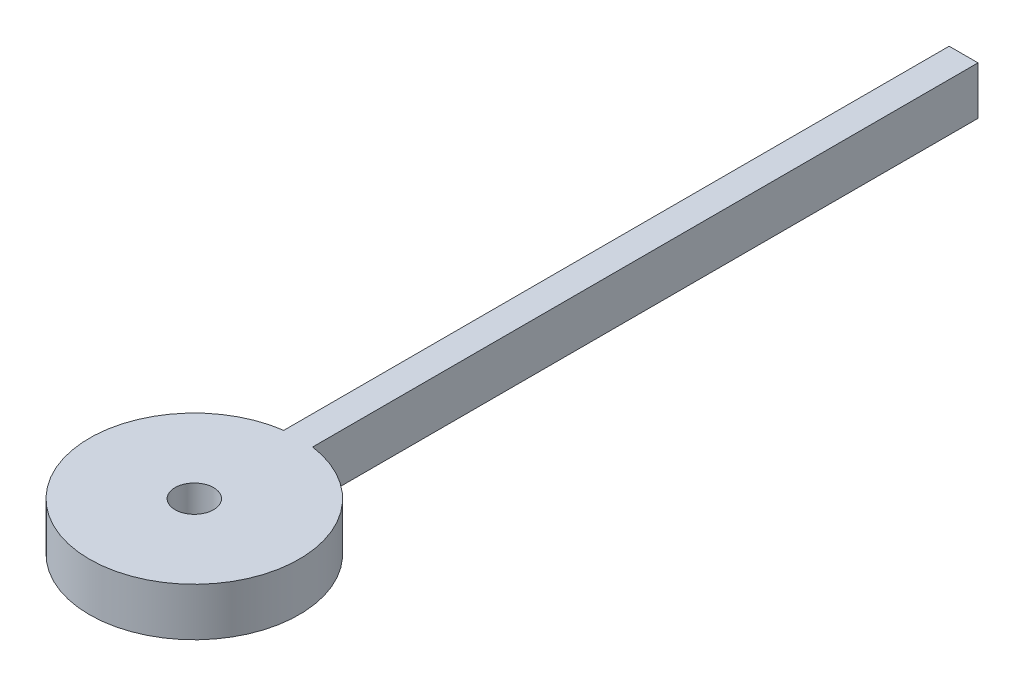
ISO-10303-21;
HEADER;
FILE_DESCRIPTION(('STEP AP214'),'2;1');
FILE_NAME('part.step','',(''),(''),'','','');
FILE_SCHEMA(('AUTOMOTIVE_DESIGN { 1 0 10303 214 1 1 1 1 }'));
ENDSEC;
DATA;
#1=APPLICATION_CONTEXT('core data for automotive mechanical design processes');
#2=APPLICATION_PROTOCOL_DEFINITION('international standard','automotive_design',2000,#1);
#3=PRODUCT_CONTEXT('',#1,'mechanical');
#4=PRODUCT('Part','Part','',(#3));
#5=PRODUCT_RELATED_PRODUCT_CATEGORY('part','',(#4));
#6=PRODUCT_DEFINITION_FORMATION('','',#4);
#7=PRODUCT_DEFINITION_CONTEXT('part definition',#1,'design');
#8=PRODUCT_DEFINITION('design','',#6,#7);
#9=PRODUCT_DEFINITION_SHAPE('','',#8);
#10=(LENGTH_UNIT() NAMED_UNIT(*) SI_UNIT(.MILLI.,.METRE.));
#11=(NAMED_UNIT(*) PLANE_ANGLE_UNIT() SI_UNIT($,.RADIAN.));
#12=(NAMED_UNIT(*) SI_UNIT($,.STERADIAN.) SOLID_ANGLE_UNIT());
#13=UNCERTAINTY_MEASURE_WITH_UNIT(LENGTH_MEASURE(1.E-05),#10,'distance_accuracy_value','');
#14=(GEOMETRIC_REPRESENTATION_CONTEXT(3) GLOBAL_UNCERTAINTY_ASSIGNED_CONTEXT((#13)) GLOBAL_UNIT_ASSIGNED_CONTEXT((#10,
#11,#12)) REPRESENTATION_CONTEXT('',''));
#15=CARTESIAN_POINT('',(0.,0.,0.));
#16=DIRECTION('',(0.,0.,1.));
#17=DIRECTION('',(1.,0.,0.));
#18=AXIS2_PLACEMENT_3D('',#15,#16,#17);
#19=CARTESIAN_POINT('',(-1.07430886798822E-13,10.,0.));
#20=DIRECTION('',(0.,1.,0.));
#21=DIRECTION('',(0.,0.,1.));
#22=AXIS2_PLACEMENT_3D('',#19,#20,#21);
#23=PLANE('',#22);
#24=DIRECTION('',(0.,0.,-1.));
#25=VECTOR('',#24,1.);
#26=CARTESIAN_POINT('',(2.99999999999989,10.,-21.6100690484735));
#27=LINE('',#26,#25);
#28=CARTESIAN_POINT('',(2.9999999999999,10.,-21.6100690484735));
#29=VERTEX_POINT('',#28);
#30=CARTESIAN_POINT('',(2.99999999999989,10.,-160.));
#31=VERTEX_POINT('',#30);
#32=EDGE_CURVE('E85',#29,#31,#27,.T.);
#33=ORIENTED_EDGE('',*,*,#32,.T.);
#34=DIRECTION('',(-1.,0.,0.));
#35=VECTOR('',#34,1.);
#36=CARTESIAN_POINT('',(-3.00000000000011,10.,-160.));
#37=LINE('',#36,#35);
#38=CARTESIAN_POINT('',(-3.00000000000011,10.,-160.));
#39=VERTEX_POINT('',#38);
#40=EDGE_CURVE('E80',#31,#39,#37,.T.);
#41=ORIENTED_EDGE('',*,*,#40,.T.);
#42=DIRECTION('',(0.,0.,1.));
#43=VECTOR('',#42,1.);
#44=CARTESIAN_POINT('',(-3.00000000000011,10.,-21.6100690484735));
#45=LINE('',#44,#43);
#46=CARTESIAN_POINT('',(-3.00000000000011,10.,-21.6100690484735));
#47=VERTEX_POINT('',#46);
#48=EDGE_CURVE('E83',#39,#47,#45,.T.);
#49=ORIENTED_EDGE('',*,*,#48,.T.);
#50=CARTESIAN_POINT('',(-1.07430886798822E-13,10.,0.));
#51=DIRECTION('',(0.,1.,0.));
#52=DIRECTION('',(0.,0.,1.));
#53=AXIS2_PLACEMENT_3D('',#50,#51,#52);
#54=CIRCLE('',#53,21.8173115731475);
#55=EDGE_CURVE('E50',#47,#29,#54,.T.);
#56=ORIENTED_EDGE('',*,*,#55,.T.);
#57=EDGE_LOOP('',(#33,#41,#49,#56));
#58=FACE_BOUND('',#57,.T.);
#59=CARTESIAN_POINT('',(-1.07430886798822E-13,10.,0.));
#60=DIRECTION('',(0.,1.,0.));
#61=DIRECTION('',(0.,0.,1.));
#62=AXIS2_PLACEMENT_3D('',#59,#60,#61);
#63=CIRCLE('',#62,4.);
#64=CARTESIAN_POINT('',(-1.07430886798822E-13,10.,4.0000000000001));
#65=VERTEX_POINT('',#64);
#66=EDGE_CURVE('E100',#65,#65,#63,.T.);
#67=ORIENTED_EDGE('',*,*,#66,.F.);
#68=EDGE_LOOP('',(#67));
#69=FACE_BOUND('',#68,.T.);
#70=ADVANCED_FACE('F33',(#58,#69),#23,.T.);
#71=CARTESIAN_POINT('',(-1.07430886798822E-13,0.,0.));
#72=DIRECTION('',(0.,1.,0.));
#73=DIRECTION('',(0.,0.,1.));
#74=AXIS2_PLACEMENT_3D('',#71,#72,#73);
#75=PLANE('',#74);
#76=DIRECTION('',(0.,0.,-1.));
#77=VECTOR('',#76,1.);
#78=CARTESIAN_POINT('',(2.99999999999989,0.,-21.6100690484735));
#79=LINE('',#78,#77);
#80=CARTESIAN_POINT('',(2.9999999999999,0.,-21.6100690484735));
#81=VERTEX_POINT('',#80);
#82=CARTESIAN_POINT('',(2.99999999999989,0.,-160.));
#83=VERTEX_POINT('',#82);
#84=EDGE_CURVE('E97',#81,#83,#79,.T.);
#85=ORIENTED_EDGE('',*,*,#84,.F.);
#86=CARTESIAN_POINT('',(-1.07430886798822E-13,0.,0.));
#87=DIRECTION('',(0.,1.,0.));
#88=DIRECTION('',(0.,0.,1.));
#89=AXIS2_PLACEMENT_3D('',#86,#87,#88);
#90=CIRCLE('',#89,21.8173115731475);
#91=CARTESIAN_POINT('',(-3.00000000000011,0.,-21.6100690484735));
#92=VERTEX_POINT('',#91);
#93=EDGE_CURVE('E73',#92,#81,#90,.T.);
#94=ORIENTED_EDGE('',*,*,#93,.F.);
#95=DIRECTION('',(0.,0.,1.));
#96=VECTOR('',#95,1.);
#97=CARTESIAN_POINT('',(-3.00000000000011,0.,-21.6100690484735));
#98=LINE('',#97,#96);
#99=CARTESIAN_POINT('',(-3.00000000000011,0.,-160.));
#100=VERTEX_POINT('',#99);
#101=EDGE_CURVE('E67',#100,#92,#98,.T.);
#102=ORIENTED_EDGE('',*,*,#101,.F.);
#103=DIRECTION('',(-1.,0.,0.));
#104=VECTOR('',#103,1.);
#105=CARTESIAN_POINT('',(-3.00000000000011,0.,-160.));
#106=LINE('',#105,#104);
#107=EDGE_CURVE('E89',#83,#100,#106,.T.);
#108=ORIENTED_EDGE('',*,*,#107,.F.);
#109=EDGE_LOOP('',(#85,#94,#102,#108));
#110=FACE_BOUND('',#109,.T.);
#111=CARTESIAN_POINT('',(-1.07430886798822E-13,0.,0.));
#112=DIRECTION('',(0.,1.,0.));
#113=DIRECTION('',(0.,0.,1.));
#114=AXIS2_PLACEMENT_3D('',#111,#112,#113);
#115=CIRCLE('',#114,4.);
#116=CARTESIAN_POINT('',(-1.07430886798822E-13,0.,4.0000000000001));
#117=VERTEX_POINT('',#116);
#118=EDGE_CURVE('E112',#117,#117,#115,.T.);
#119=ORIENTED_EDGE('',*,*,#118,.T.);
#120=EDGE_LOOP('',(#119));
#121=FACE_BOUND('',#120,.T.);
#122=ADVANCED_FACE('F108',(#110,#121),#75,.F.);
#123=CARTESIAN_POINT('',(2.99999999999989,10.,-21.6100690484735));
#124=DIRECTION('',(-1.,0.,0.));
#125=DIRECTION('',(0.,0.,1.));
#126=AXIS2_PLACEMENT_3D('',#123,#124,#125);
#127=PLANE('',#126);
#128=ORIENTED_EDGE('',*,*,#84,.T.);
#129=DIRECTION('',(0.,-1.,0.));
#130=VECTOR('',#129,1.);
#131=CARTESIAN_POINT('',(2.99999999999989,10.,-160.));
#132=LINE('',#131,#130);
#133=EDGE_CURVE('E11',#31,#83,#132,.T.);
#134=ORIENTED_EDGE('',*,*,#133,.F.);
#135=ORIENTED_EDGE('',*,*,#32,.F.);
#136=DIRECTION('',(0.,-1.,0.));
#137=VECTOR('',#136,1.);
#138=CARTESIAN_POINT('',(2.9999999999999,10.,-21.6100690484735));
#139=LINE('',#138,#137);
#140=EDGE_CURVE('E93',#29,#81,#139,.T.);
#141=ORIENTED_EDGE('',*,*,#140,.T.);
#142=EDGE_LOOP('',(#128,#134,#135,#141));
#143=FACE_BOUND('',#142,.T.);
#144=ADVANCED_FACE('F35',(#143),#127,.F.);
#145=CARTESIAN_POINT('',(-3.00000000000011,10.,-160.));
#146=DIRECTION('',(0.,0.,1.));
#147=DIRECTION('',(1.,0.,0.));
#148=AXIS2_PLACEMENT_3D('',#145,#146,#147);
#149=PLANE('',#148);
#150=ORIENTED_EDGE('',*,*,#107,.T.);
#151=DIRECTION('',(0.,-1.,0.));
#152=VECTOR('',#151,1.);
#153=CARTESIAN_POINT('',(-3.00000000000011,10.,-160.));
#154=LINE('',#153,#152);
#155=EDGE_CURVE('E42',#39,#100,#154,.T.);
#156=ORIENTED_EDGE('',*,*,#155,.F.);
#157=ORIENTED_EDGE('',*,*,#40,.F.);
#158=ORIENTED_EDGE('',*,*,#133,.T.);
#159=EDGE_LOOP('',(#150,#156,#157,#158));
#160=FACE_BOUND('',#159,.T.);
#161=ADVANCED_FACE('F88',(#160),#149,.F.);
#162=CARTESIAN_POINT('',(-3.00000000000011,10.,-21.6100690484735));
#163=DIRECTION('',(1.,0.,0.));
#164=DIRECTION('',(0.,0.,-1.));
#165=AXIS2_PLACEMENT_3D('',#162,#163,#164);
#166=PLANE('',#165);
#167=ORIENTED_EDGE('',*,*,#101,.T.);
#168=DIRECTION('',(0.,-1.,0.));
#169=VECTOR('',#168,1.);
#170=CARTESIAN_POINT('',(-3.00000000000011,10.,-21.6100690484735));
#171=LINE('',#170,#169);
#172=EDGE_CURVE('E90',#47,#92,#171,.T.);
#173=ORIENTED_EDGE('',*,*,#172,.F.);
#174=ORIENTED_EDGE('',*,*,#48,.F.);
#175=ORIENTED_EDGE('',*,*,#155,.T.);
#176=EDGE_LOOP('',(#167,#173,#174,#175));
#177=FACE_BOUND('',#176,.T.);
#178=ADVANCED_FACE('F91',(#177),#166,.F.);
#179=CARTESIAN_POINT('',(-1.07430886798822E-13,10.,0.));
#180=DIRECTION('',(0.,-1.,0.));
#181=DIRECTION('',(0.,0.,-1.));
#182=AXIS2_PLACEMENT_3D('',#179,#180,#181);
#183=CYLINDRICAL_SURFACE('',#182,21.8173115731475);
#184=ORIENTED_EDGE('',*,*,#93,.T.);
#185=ORIENTED_EDGE('',*,*,#140,.F.);
#186=ORIENTED_EDGE('',*,*,#55,.F.);
#187=ORIENTED_EDGE('',*,*,#172,.T.);
#188=EDGE_LOOP('',(#184,#185,#186,#187));
#189=FACE_BOUND('',#188,.T.);
#190=ADVANCED_FACE('F105',(#189),#183,.T.);
#191=CARTESIAN_POINT('',(-1.07430886798822E-13,10.,0.));
#192=DIRECTION('',(0.,-1.,0.));
#193=DIRECTION('',(0.,0.,-1.));
#194=AXIS2_PLACEMENT_3D('',#191,#192,#193);
#195=CYLINDRICAL_SURFACE('',#194,4.);
#196=ORIENTED_EDGE('',*,*,#66,.T.);
#197=EDGE_LOOP('',(#196));
#198=FACE_BOUND('',#197,.T.);
#199=ORIENTED_EDGE('',*,*,#118,.F.);
#200=EDGE_LOOP('',(#199));
#201=FACE_BOUND('',#200,.T.);
#202=ADVANCED_FACE('F118',(#198,#201),#195,.F.);
#203=CLOSED_SHELL('',(#70,#122,#144,#161,#178,#190,#202));
#204=MANIFOLD_SOLID_BREP('B2',#203);
#205=ADVANCED_BREP_SHAPE_REPRESENTATION('',(#18,#204),#14);
#206=SHAPE_DEFINITION_REPRESENTATION(#9,#205);
ENDSEC;
END-ISO-10303-21;
